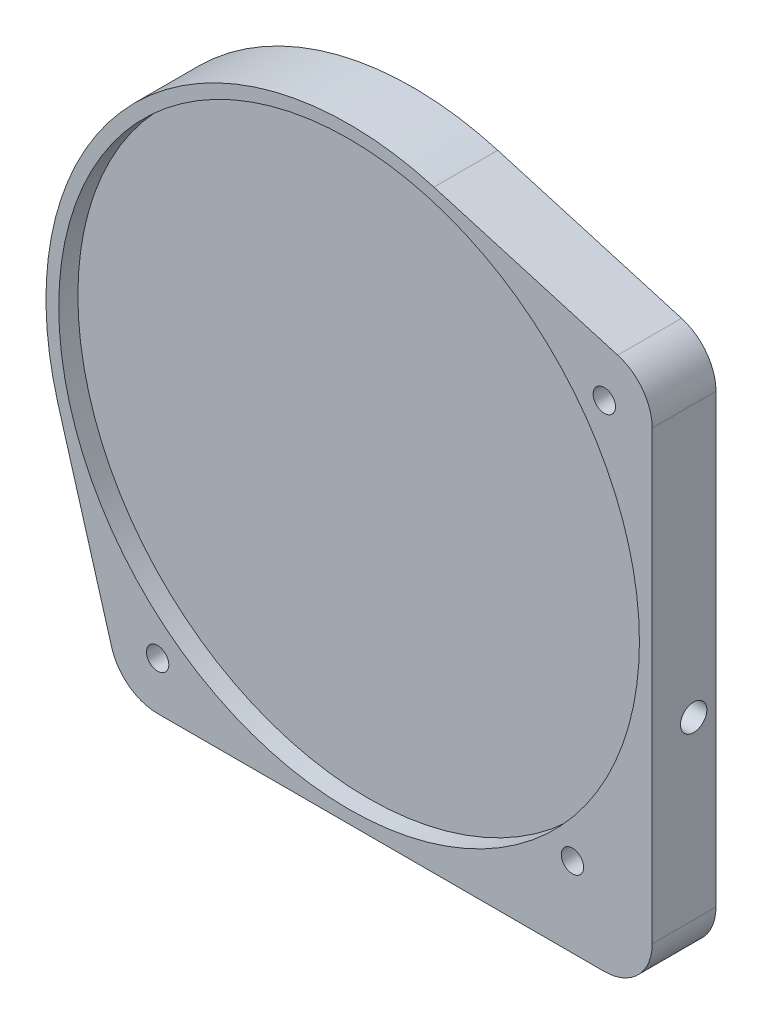
ISO-10303-21;
HEADER;
FILE_DESCRIPTION(('STEP AP214'),'2;1');
FILE_NAME('part.step','',(''),(''),'','','');
FILE_SCHEMA(('AUTOMOTIVE_DESIGN { 1 0 10303 214 1 1 1 1 }'));
ENDSEC;
DATA;
#1=APPLICATION_CONTEXT('core data for automotive mechanical design processes');
#2=APPLICATION_PROTOCOL_DEFINITION('international standard','automotive_design',2000,#1);
#3=PRODUCT_CONTEXT('',#1,'mechanical');
#4=PRODUCT('Part','Part','',(#3));
#5=PRODUCT_RELATED_PRODUCT_CATEGORY('part','',(#4));
#6=PRODUCT_DEFINITION_FORMATION('','',#4);
#7=PRODUCT_DEFINITION_CONTEXT('part definition',#1,'design');
#8=PRODUCT_DEFINITION('design','',#6,#7);
#9=PRODUCT_DEFINITION_SHAPE('','',#8);
#10=(LENGTH_UNIT() NAMED_UNIT(*) SI_UNIT(.MILLI.,.METRE.));
#11=(NAMED_UNIT(*) PLANE_ANGLE_UNIT() SI_UNIT($,.RADIAN.));
#12=(NAMED_UNIT(*) SI_UNIT($,.STERADIAN.) SOLID_ANGLE_UNIT());
#13=UNCERTAINTY_MEASURE_WITH_UNIT(LENGTH_MEASURE(1.E-05),#10,'distance_accuracy_value','');
#14=(GEOMETRIC_REPRESENTATION_CONTEXT(3) GLOBAL_UNCERTAINTY_ASSIGNED_CONTEXT((#13)) GLOBAL_UNIT_ASSIGNED_CONTEXT((#10,
#11,#12)) REPRESENTATION_CONTEXT('',''));
#15=CARTESIAN_POINT('',(0.,0.,0.));
#16=DIRECTION('',(0.,0.,1.));
#17=DIRECTION('',(1.,0.,0.));
#18=AXIS2_PLACEMENT_3D('',#15,#16,#17);
#19=CARTESIAN_POINT('',(0.,0.,7.));
#20=DIRECTION('',(0.,0.,-1.));
#21=DIRECTION('',(-1.,0.,0.));
#22=AXIS2_PLACEMENT_3D('',#19,#20,#21);
#23=PLANE('',#22);
#24=CARTESIAN_POINT('',(0.,0.,7.));
#25=DIRECTION('',(0.,0.,-1.));
#26=DIRECTION('',(-1.,0.,0.));
#27=AXIS2_PLACEMENT_3D('',#24,#25,#26);
#28=CIRCLE('',#27,45.5);
#29=CARTESIAN_POINT('',(-45.5,0.,7.));
#30=VERTEX_POINT('',#29);
#31=EDGE_CURVE('E20',#30,#30,#28,.F.);
#32=ORIENTED_EDGE('',*,*,#31,.T.);
#33=EDGE_LOOP('',(#32));
#34=FACE_BOUND('',#33,.T.);
#35=ADVANCED_FACE('F17',(#34),#23,.F.);
#36=CARTESIAN_POINT('',(12.5,-35.5000000012069,3.5));
#37=DIRECTION('',(0.,-1.,0.));
#38=DIRECTION('',(1.,0.,0.));
#39=AXIS2_PLACEMENT_3D('',#36,#37,#38);
#40=CONICAL_SURFACE('',#39,2.0669999992606,1.02974425746904);
#41=CARTESIAN_POINT('',(12.4999999999318,-34.2580210987649,3.5));
#42=VERTEX_POINT('',#41);
#43=VERTEX_LOOP('',#42);
#44=FACE_BOUND('',#43,.T.);
#45=CARTESIAN_POINT('',(12.5,-35.5,3.5));
#46=DIRECTION('',(0.,-1.,0.));
#47=DIRECTION('',(1.,0.,0.));
#48=AXIS2_PLACEMENT_3D('',#45,#46,#47);
#49=CIRCLE('',#48,2.067);
#50=CARTESIAN_POINT('',(14.567,-35.5,3.5));
#51=VERTEX_POINT('',#50);
#52=EDGE_CURVE('E95',#51,#51,#49,.T.);
#53=ORIENTED_EDGE('',*,*,#52,.T.);
#54=EDGE_LOOP('',(#53));
#55=FACE_BOUND('',#54,.T.);
#56=ADVANCED_FACE('F89',(#44,#55),#40,.F.);
#57=CARTESIAN_POINT('',(35.5000000012069,-12.5,3.5));
#58=DIRECTION('',(1.,0.,0.));
#59=DIRECTION('',(0.,0.,-1.));
#60=AXIS2_PLACEMENT_3D('',#57,#58,#59);
#61=CONICAL_SURFACE('',#60,2.06699999924103,1.02974425750216);
#62=CARTESIAN_POINT('',(34.2580210988785,-12.5,3.49999999991724));
#63=VERTEX_POINT('',#62);
#64=VERTEX_LOOP('',#63);
#65=FACE_BOUND('',#64,.T.);
#66=CARTESIAN_POINT('',(35.5,-12.5,3.5));
#67=DIRECTION('',(1.,0.,0.));
#68=DIRECTION('',(0.,1.,0.));
#69=AXIS2_PLACEMENT_3D('',#66,#67,#68);
#70=CIRCLE('',#69,2.067);
#71=CARTESIAN_POINT('',(35.5,-10.433,3.5));
#72=VERTEX_POINT('',#71);
#73=EDGE_CURVE('E97',#72,#72,#70,.T.);
#74=ORIENTED_EDGE('',*,*,#73,.T.);
#75=EDGE_LOOP('',(#74));
#76=FACE_BOUND('',#75,.T.);
#77=ADVANCED_FACE('F92',(#65,#76),#61,.F.);
#78=CARTESIAN_POINT('',(0.,0.,10.));
#79=DIRECTION('',(0.,0.,-1.));
#80=DIRECTION('',(-1.,0.,0.));
#81=AXIS2_PLACEMENT_3D('',#78,#79,#80);
#82=CYLINDRICAL_SURFACE('',#81,45.5);
#83=CARTESIAN_POINT('',(0.,0.,10.));
#84=DIRECTION('',(0.,0.,-1.));
#85=DIRECTION('',(-1.,0.,0.));
#86=AXIS2_PLACEMENT_3D('',#83,#84,#85);
#87=CIRCLE('',#86,45.5);
#88=CARTESIAN_POINT('',(-45.5,0.,10.));
#89=VERTEX_POINT('',#88);
#90=EDGE_CURVE('E100',#89,#89,#87,.T.);
#91=ORIENTED_EDGE('',*,*,#90,.F.);
#92=EDGE_LOOP('',(#91));
#93=FACE_BOUND('',#92,.T.);
#94=ORIENTED_EDGE('',*,*,#31,.F.);
#95=EDGE_LOOP('',(#94));
#96=FACE_BOUND('',#95,.T.);
#97=ADVANCED_FACE('F169',(#93,#96),#82,.F.);
#98=CARTESIAN_POINT('',(12.5,-41.5,3.5));
#99=DIRECTION('',(0.,-1.,0.));
#100=DIRECTION('',(1.,0.,0.));
#101=AXIS2_PLACEMENT_3D('',#98,#99,#100);
#102=CYLINDRICAL_SURFACE('',#101,2.067);
#103=ORIENTED_EDGE('',*,*,#52,.F.);
#104=EDGE_LOOP('',(#103));
#105=FACE_BOUND('',#104,.T.);
#106=CARTESIAN_POINT('',(12.5,-47.5,3.5));
#107=DIRECTION('',(0.,-1.,0.));
#108=DIRECTION('',(1.,0.,0.));
#109=AXIS2_PLACEMENT_3D('',#106,#107,#108);
#110=CIRCLE('',#109,2.067);
#111=CARTESIAN_POINT('',(14.567,-47.5,3.5));
#112=VERTEX_POINT('',#111);
#113=EDGE_CURVE('E153',#112,#112,#110,.F.);
#114=ORIENTED_EDGE('',*,*,#113,.F.);
#115=EDGE_LOOP('',(#114));
#116=FACE_BOUND('',#115,.T.);
#117=ADVANCED_FACE('F172',(#105,#116),#102,.F.);
#118=CARTESIAN_POINT('',(41.5,-12.5,3.5));
#119=DIRECTION('',(1.,0.,0.));
#120=DIRECTION('',(0.,1.,0.));
#121=AXIS2_PLACEMENT_3D('',#118,#119,#120);
#122=CYLINDRICAL_SURFACE('',#121,2.067);
#123=ORIENTED_EDGE('',*,*,#73,.F.);
#124=EDGE_LOOP('',(#123));
#125=FACE_BOUND('',#124,.T.);
#126=CARTESIAN_POINT('',(47.5,-12.5,3.5));
#127=DIRECTION('',(1.,0.,0.));
#128=DIRECTION('',(0.,1.,0.));
#129=AXIS2_PLACEMENT_3D('',#126,#127,#128);
#130=CIRCLE('',#129,2.067);
#131=CARTESIAN_POINT('',(47.5,-10.433,3.5));
#132=VERTEX_POINT('',#131);
#133=EDGE_CURVE('E146',#132,#132,#130,.F.);
#134=ORIENTED_EDGE('',*,*,#133,.F.);
#135=EDGE_LOOP('',(#134));
#136=FACE_BOUND('',#135,.T.);
#137=ADVANCED_FACE('F234',(#125,#136),#122,.F.);
#138=CARTESIAN_POINT('',(3.65924685578279,-3.6592468557828,10.));
#139=DIRECTION('',(0.,0.,1.));
#140=DIRECTION('',(1.,0.,0.));
#141=AXIS2_PLACEMENT_3D('',#138,#139,#140);
#142=PLANE('',#141);
#143=ORIENTED_EDGE('',*,*,#90,.T.);
#144=EDGE_LOOP('',(#143));
#145=FACE_BOUND('',#144,.T.);
#146=CARTESIAN_POINT('',(40.,30.,10.));
#147=DIRECTION('',(0.,0.,1.));
#148=DIRECTION('',(1.,0.,0.));
#149=AXIS2_PLACEMENT_3D('',#146,#147,#148);
#150=CIRCLE('',#149,1.75);
#151=CARTESIAN_POINT('',(41.75,30.,10.));
#152=VERTEX_POINT('',#151);
#153=EDGE_CURVE('E137',#152,#152,#150,.F.);
#154=ORIENTED_EDGE('',*,*,#153,.T.);
#155=EDGE_LOOP('',(#154));
#156=FACE_BOUND('',#155,.T.);
#157=CARTESIAN_POINT('',(-30.,-40.,10.));
#158=DIRECTION('',(0.,0.,1.));
#159=DIRECTION('',(1.,0.,0.));
#160=AXIS2_PLACEMENT_3D('',#157,#158,#159);
#161=CIRCLE('',#160,1.75);
#162=CARTESIAN_POINT('',(-28.25,-40.,10.));
#163=VERTEX_POINT('',#162);
#164=EDGE_CURVE('E140',#163,#163,#161,.F.);
#165=ORIENTED_EDGE('',*,*,#164,.T.);
#166=EDGE_LOOP('',(#165));
#167=FACE_BOUND('',#166,.T.);
#168=CARTESIAN_POINT('',(35.,-35.,10.));
#169=DIRECTION('',(0.,0.,1.));
#170=DIRECTION('',(1.,0.,0.));
#171=AXIS2_PLACEMENT_3D('',#168,#169,#170);
#172=CIRCLE('',#171,1.75);
#173=CARTESIAN_POINT('',(36.75,-35.,10.));
#174=VERTEX_POINT('',#173);
#175=EDGE_CURVE('E143',#174,#174,#172,.F.);
#176=ORIENTED_EDGE('',*,*,#175,.T.);
#177=EDGE_LOOP('',(#176));
#178=FACE_BOUND('',#177,.T.);
#179=CARTESIAN_POINT('',(-30.,-40.,10.));
#180=DIRECTION('',(0.,0.,1.));
#181=DIRECTION('',(1.,0.,0.));
#182=AXIS2_PLACEMENT_3D('',#179,#180,#181);
#183=CIRCLE('',#182,7.49999999999999);
#184=CARTESIAN_POINT('',(-30.,-47.5,10.));
#185=VERTEX_POINT('',#184);
#186=CARTESIAN_POINT('',(-37.2,-42.1,10.));
#187=VERTEX_POINT('',#186);
#188=EDGE_CURVE('E157',#185,#187,#183,.F.);
#189=ORIENTED_EDGE('',*,*,#188,.F.);
#190=DIRECTION('',(1.,0.,0.));
#191=VECTOR('',#190,1.);
#192=CARTESIAN_POINT('',(40.,-47.5,10.));
#193=LINE('',#192,#191);
#194=CARTESIAN_POINT('',(40.,-47.5,10.));
#195=VERTEX_POINT('',#194);
#196=EDGE_CURVE('E105',#195,#185,#193,.F.);
#197=ORIENTED_EDGE('',*,*,#196,.F.);
#198=CARTESIAN_POINT('',(40.,-40.,10.));
#199=DIRECTION('',(0.,0.,1.));
#200=DIRECTION('',(1.,0.,0.));
#201=AXIS2_PLACEMENT_3D('',#198,#199,#200);
#202=CIRCLE('',#201,7.49999999999998);
#203=CARTESIAN_POINT('',(47.4999999999999,-40.,10.));
#204=VERTEX_POINT('',#203);
#205=EDGE_CURVE('E150',#204,#195,#202,.F.);
#206=ORIENTED_EDGE('',*,*,#205,.F.);
#207=DIRECTION('',(0.,1.,0.));
#208=VECTOR('',#207,1.);
#209=CARTESIAN_POINT('',(47.4999999999999,30.,10.));
#210=LINE('',#209,#208);
#211=CARTESIAN_POINT('',(47.4999999999999,30.,10.));
#212=VERTEX_POINT('',#211);
#213=EDGE_CURVE('E261',#212,#204,#210,.F.);
#214=ORIENTED_EDGE('',*,*,#213,.F.);
#215=CARTESIAN_POINT('',(40.,30.,10.));
#216=DIRECTION('',(0.,0.,1.));
#217=DIRECTION('',(1.,0.,0.));
#218=AXIS2_PLACEMENT_3D('',#215,#216,#217);
#219=CIRCLE('',#218,7.50000000000001);
#220=CARTESIAN_POINT('',(42.1,37.2,10.));
#221=VERTEX_POINT('',#220);
#222=EDGE_CURVE('E114',#221,#212,#219,.F.);
#223=ORIENTED_EDGE('',*,*,#222,.F.);
#224=DIRECTION('',(-0.96,0.28,0.));
#225=VECTOR('',#224,1.);
#226=CARTESIAN_POINT('',(13.3,45.6,10.));
#227=LINE('',#226,#225);
#228=CARTESIAN_POINT('',(13.3,45.6,10.));
#229=VERTEX_POINT('',#228);
#230=EDGE_CURVE('E81',#229,#221,#227,.F.);
#231=ORIENTED_EDGE('',*,*,#230,.F.);
#232=CARTESIAN_POINT('',(0.,0.,10.));
#233=DIRECTION('',(0.,0.,1.));
#234=DIRECTION('',(1.,0.,0.));
#235=AXIS2_PLACEMENT_3D('',#232,#233,#234);
#236=CIRCLE('',#235,47.5);
#237=CARTESIAN_POINT('',(-45.6,-13.3,10.));
#238=VERTEX_POINT('',#237);
#239=EDGE_CURVE('E160',#238,#229,#236,.F.);
#240=ORIENTED_EDGE('',*,*,#239,.F.);
#241=DIRECTION('',(0.28,-0.96,0.));
#242=VECTOR('',#241,1.);
#243=CARTESIAN_POINT('',(-37.2,-42.1,10.));
#244=LINE('',#243,#242);
#245=EDGE_CURVE('E109',#187,#238,#244,.F.);
#246=ORIENTED_EDGE('',*,*,#245,.F.);
#247=EDGE_LOOP('',(#189,#197,#206,#214,#223,#231,#240,#246));
#248=FACE_BOUND('',#247,.T.);
#249=ADVANCED_FACE('F166',(#145,#156,#167,#178,#248),#142,.T.);
#250=CARTESIAN_POINT('',(40.,30.,0.));
#251=DIRECTION('',(0.,0.,1.));
#252=DIRECTION('',(1.,0.,0.));
#253=AXIS2_PLACEMENT_3D('',#250,#251,#252);
#254=CYLINDRICAL_SURFACE('',#253,7.50000000000001);
#255=CARTESIAN_POINT('',(40.,30.,0.));
#256=DIRECTION('',(0.,0.,1.));
#257=DIRECTION('',(1.,0.,0.));
#258=AXIS2_PLACEMENT_3D('',#255,#256,#257);
#259=CIRCLE('',#258,7.50000000000001);
#260=CARTESIAN_POINT('',(47.5,30.,0.));
#261=VERTEX_POINT('',#260);
#262=CARTESIAN_POINT('',(42.1,37.2,0.));
#263=VERTEX_POINT('',#262);
#264=EDGE_CURVE('E134',#261,#263,#259,.T.);
#265=ORIENTED_EDGE('',*,*,#264,.T.);
#266=DIRECTION('',(0.,0.,1.));
#267=VECTOR('',#266,1.);
#268=CARTESIAN_POINT('',(42.1,37.2,0.));
#269=LINE('',#268,#267);
#270=EDGE_CURVE('E113',#221,#263,#269,.F.);
#271=ORIENTED_EDGE('',*,*,#270,.F.);
#272=ORIENTED_EDGE('',*,*,#222,.T.);
#273=DIRECTION('',(0.,0.,-1.));
#274=VECTOR('',#273,1.);
#275=CARTESIAN_POINT('',(47.4999999999999,30.,0.));
#276=LINE('',#275,#274);
#277=EDGE_CURVE('E149',#261,#212,#276,.F.);
#278=ORIENTED_EDGE('',*,*,#277,.F.);
#279=EDGE_LOOP('',(#265,#271,#272,#278));
#280=FACE_BOUND('',#279,.T.);
#281=ADVANCED_FACE('F228',(#280),#254,.T.);
#282=CARTESIAN_POINT('',(13.3,45.6,0.));
#283=DIRECTION('',(0.28,0.96,0.));
#284=DIRECTION('',(-0.96,0.28,0.));
#285=AXIS2_PLACEMENT_3D('',#282,#283,#284);
#286=PLANE('',#285);
#287=DIRECTION('',(-0.96,0.28,0.));
#288=VECTOR('',#287,1.);
#289=CARTESIAN_POINT('',(42.1,37.2,0.));
#290=LINE('',#289,#288);
#291=CARTESIAN_POINT('',(13.3,45.6,0.));
#292=VERTEX_POINT('',#291);
#293=EDGE_CURVE('E133',#263,#292,#290,.T.);
#294=ORIENTED_EDGE('',*,*,#293,.T.);
#295=DIRECTION('',(0.,0.,1.));
#296=VECTOR('',#295,1.);
#297=CARTESIAN_POINT('',(13.3,45.6,0.));
#298=LINE('',#297,#296);
#299=EDGE_CURVE('E112',#229,#292,#298,.F.);
#300=ORIENTED_EDGE('',*,*,#299,.F.);
#301=ORIENTED_EDGE('',*,*,#230,.T.);
#302=ORIENTED_EDGE('',*,*,#270,.T.);
#303=EDGE_LOOP('',(#294,#300,#301,#302));
#304=FACE_BOUND('',#303,.T.);
#305=ADVANCED_FACE('F224',(#304),#286,.T.);
#306=CARTESIAN_POINT('',(0.,0.,0.));
#307=DIRECTION('',(0.,0.,1.));
#308=DIRECTION('',(1.,0.,0.));
#309=AXIS2_PLACEMENT_3D('',#306,#307,#308);
#310=CYLINDRICAL_SURFACE('',#309,47.5);
#311=CARTESIAN_POINT('',(0.,0.,0.));
#312=DIRECTION('',(0.,0.,1.));
#313=DIRECTION('',(1.,0.,0.));
#314=AXIS2_PLACEMENT_3D('',#311,#312,#313);
#315=CIRCLE('',#314,47.5);
#316=CARTESIAN_POINT('',(-45.6,-13.3,0.));
#317=VERTEX_POINT('',#316);
#318=EDGE_CURVE('E130',#292,#317,#315,.T.);
#319=ORIENTED_EDGE('',*,*,#318,.T.);
#320=DIRECTION('',(0.,0.,1.));
#321=VECTOR('',#320,1.);
#322=CARTESIAN_POINT('',(-45.6,-13.3,0.));
#323=LINE('',#322,#321);
#324=EDGE_CURVE('E111',#238,#317,#323,.F.);
#325=ORIENTED_EDGE('',*,*,#324,.F.);
#326=ORIENTED_EDGE('',*,*,#239,.T.);
#327=ORIENTED_EDGE('',*,*,#299,.T.);
#328=EDGE_LOOP('',(#319,#325,#326,#327));
#329=FACE_BOUND('',#328,.T.);
#330=ADVANCED_FACE('F220',(#329),#310,.T.);
#331=CARTESIAN_POINT('',(-37.2,-42.1,0.));
#332=DIRECTION('',(-0.96,-0.28,0.));
#333=DIRECTION('',(0.28,-0.96,0.));
#334=AXIS2_PLACEMENT_3D('',#331,#332,#333);
#335=PLANE('',#334);
#336=DIRECTION('',(0.28,-0.96,0.));
#337=VECTOR('',#336,1.);
#338=CARTESIAN_POINT('',(-45.6,-13.3,0.));
#339=LINE('',#338,#337);
#340=CARTESIAN_POINT('',(-37.2,-42.1,0.));
#341=VERTEX_POINT('',#340);
#342=EDGE_CURVE('E129',#317,#341,#339,.T.);
#343=ORIENTED_EDGE('',*,*,#342,.T.);
#344=DIRECTION('',(0.,0.,1.));
#345=VECTOR('',#344,1.);
#346=CARTESIAN_POINT('',(-37.2,-42.1,0.));
#347=LINE('',#346,#345);
#348=EDGE_CURVE('E159',#187,#341,#347,.F.);
#349=ORIENTED_EDGE('',*,*,#348,.F.);
#350=ORIENTED_EDGE('',*,*,#245,.T.);
#351=ORIENTED_EDGE('',*,*,#324,.T.);
#352=EDGE_LOOP('',(#343,#349,#350,#351));
#353=FACE_BOUND('',#352,.T.);
#354=ADVANCED_FACE('F216',(#353),#335,.T.);
#355=CARTESIAN_POINT('',(-30.,-40.,0.));
#356=DIRECTION('',(0.,0.,1.));
#357=DIRECTION('',(1.,0.,0.));
#358=AXIS2_PLACEMENT_3D('',#355,#356,#357);
#359=CYLINDRICAL_SURFACE('',#358,7.49999999999999);
#360=CARTESIAN_POINT('',(-30.,-40.,0.));
#361=DIRECTION('',(0.,0.,1.));
#362=DIRECTION('',(1.,0.,0.));
#363=AXIS2_PLACEMENT_3D('',#360,#361,#362);
#364=CIRCLE('',#363,7.49999999999999);
#365=CARTESIAN_POINT('',(-30.,-47.5,0.));
#366=VERTEX_POINT('',#365);
#367=EDGE_CURVE('E126',#341,#366,#364,.T.);
#368=ORIENTED_EDGE('',*,*,#367,.T.);
#369=DIRECTION('',(0.,0.,-1.));
#370=VECTOR('',#369,1.);
#371=CARTESIAN_POINT('',(-30.,-47.5,0.));
#372=LINE('',#371,#370);
#373=EDGE_CURVE('E156',#185,#366,#372,.T.);
#374=ORIENTED_EDGE('',*,*,#373,.F.);
#375=ORIENTED_EDGE('',*,*,#188,.T.);
#376=ORIENTED_EDGE('',*,*,#348,.T.);
#377=EDGE_LOOP('',(#368,#374,#375,#376));
#378=FACE_BOUND('',#377,.T.);
#379=ADVANCED_FACE('F212',(#378),#359,.T.);
#380=CARTESIAN_POINT('',(40.,-47.5,0.));
#381=DIRECTION('',(0.,-1.,0.));
#382=DIRECTION('',(0.,0.,-1.));
#383=AXIS2_PLACEMENT_3D('',#380,#381,#382);
#384=PLANE('',#383);
#385=ORIENTED_EDGE('',*,*,#113,.T.);
#386=EDGE_LOOP('',(#385));
#387=FACE_BOUND('',#386,.T.);
#388=DIRECTION('',(1.,0.,0.));
#389=VECTOR('',#388,1.);
#390=CARTESIAN_POINT('',(3.65924685578279,-47.5000000000001,0.));
#391=LINE('',#390,#389);
#392=CARTESIAN_POINT('',(40.,-47.5,0.));
#393=VERTEX_POINT('',#392);
#394=EDGE_CURVE('E125',#366,#393,#391,.T.);
#395=ORIENTED_EDGE('',*,*,#394,.T.);
#396=DIRECTION('',(0.,0.,1.));
#397=VECTOR('',#396,1.);
#398=CARTESIAN_POINT('',(40.,-47.5,0.));
#399=LINE('',#398,#397);
#400=EDGE_CURVE('E152',#195,#393,#399,.F.);
#401=ORIENTED_EDGE('',*,*,#400,.F.);
#402=ORIENTED_EDGE('',*,*,#196,.T.);
#403=ORIENTED_EDGE('',*,*,#373,.T.);
#404=EDGE_LOOP('',(#395,#401,#402,#403));
#405=FACE_BOUND('',#404,.T.);
#406=ADVANCED_FACE('F208',(#387,#405),#384,.T.);
#407=CARTESIAN_POINT('',(40.,-40.,0.));
#408=DIRECTION('',(0.,0.,1.));
#409=DIRECTION('',(1.,0.,0.));
#410=AXIS2_PLACEMENT_3D('',#407,#408,#409);
#411=CYLINDRICAL_SURFACE('',#410,7.49999999999998);
#412=CARTESIAN_POINT('',(40.,-40.,0.));
#413=DIRECTION('',(0.,0.,1.));
#414=DIRECTION('',(1.,0.,0.));
#415=AXIS2_PLACEMENT_3D('',#412,#413,#414);
#416=CIRCLE('',#415,7.49999999999998);
#417=CARTESIAN_POINT('',(47.5,-40.,0.));
#418=VERTEX_POINT('',#417);
#419=EDGE_CURVE('E122',#393,#418,#416,.T.);
#420=ORIENTED_EDGE('',*,*,#419,.T.);
#421=DIRECTION('',(0.,0.,-1.));
#422=VECTOR('',#421,1.);
#423=CARTESIAN_POINT('',(47.4999999999999,-40.,0.));
#424=LINE('',#423,#422);
#425=EDGE_CURVE('E35',#204,#418,#424,.T.);
#426=ORIENTED_EDGE('',*,*,#425,.F.);
#427=ORIENTED_EDGE('',*,*,#205,.T.);
#428=ORIENTED_EDGE('',*,*,#400,.T.);
#429=EDGE_LOOP('',(#420,#426,#427,#428));
#430=FACE_BOUND('',#429,.T.);
#431=ADVANCED_FACE('F204',(#430),#411,.T.);
#432=CARTESIAN_POINT('',(47.4999999999999,30.,0.));
#433=DIRECTION('',(1.,0.,0.));
#434=DIRECTION('',(0.,0.,-1.));
#435=AXIS2_PLACEMENT_3D('',#432,#433,#434);
#436=PLANE('',#435);
#437=ORIENTED_EDGE('',*,*,#133,.T.);
#438=EDGE_LOOP('',(#437));
#439=FACE_BOUND('',#438,.T.);
#440=DIRECTION('',(0.,1.,0.));
#441=VECTOR('',#440,1.);
#442=CARTESIAN_POINT('',(47.5,-3.6592468557828,0.));
#443=LINE('',#442,#441);
#444=EDGE_CURVE('E121',#418,#261,#443,.T.);
#445=ORIENTED_EDGE('',*,*,#444,.T.);
#446=ORIENTED_EDGE('',*,*,#277,.T.);
#447=ORIENTED_EDGE('',*,*,#213,.T.);
#448=ORIENTED_EDGE('',*,*,#425,.T.);
#449=EDGE_LOOP('',(#445,#446,#447,#448));
#450=FACE_BOUND('',#449,.T.);
#451=ADVANCED_FACE('F200',(#439,#450),#436,.T.);
#452=CARTESIAN_POINT('',(35.,-35.,-124.721935853075));
#453=DIRECTION('',(0.,0.,1.));
#454=DIRECTION('',(1.,0.,0.));
#455=AXIS2_PLACEMENT_3D('',#452,#453,#454);
#456=CYLINDRICAL_SURFACE('',#455,1.75);
#457=ORIENTED_EDGE('',*,*,#175,.F.);
#458=EDGE_LOOP('',(#457));
#459=FACE_BOUND('',#458,.T.);
#460=CARTESIAN_POINT('',(35.,-35.,0.));
#461=DIRECTION('',(0.,0.,1.));
#462=DIRECTION('',(1.,0.,0.));
#463=AXIS2_PLACEMENT_3D('',#460,#461,#462);
#464=CIRCLE('',#463,1.75);
#465=CARTESIAN_POINT('',(36.75,-35.,0.));
#466=VERTEX_POINT('',#465);
#467=EDGE_CURVE('E118',#466,#466,#464,.F.);
#468=ORIENTED_EDGE('',*,*,#467,.T.);
#469=EDGE_LOOP('',(#468));
#470=FACE_BOUND('',#469,.T.);
#471=ADVANCED_FACE('F196',(#459,#470),#456,.F.);
#472=CARTESIAN_POINT('',(-30.,-40.,-124.721935853075));
#473=DIRECTION('',(0.,0.,1.));
#474=DIRECTION('',(1.,0.,0.));
#475=AXIS2_PLACEMENT_3D('',#472,#473,#474);
#476=CYLINDRICAL_SURFACE('',#475,1.75);
#477=ORIENTED_EDGE('',*,*,#164,.F.);
#478=EDGE_LOOP('',(#477));
#479=FACE_BOUND('',#478,.T.);
#480=CARTESIAN_POINT('',(-30.,-40.,0.));
#481=DIRECTION('',(0.,0.,1.));
#482=DIRECTION('',(1.,0.,0.));
#483=AXIS2_PLACEMENT_3D('',#480,#481,#482);
#484=CIRCLE('',#483,1.75);
#485=CARTESIAN_POINT('',(-28.25,-40.,0.));
#486=VERTEX_POINT('',#485);
#487=EDGE_CURVE('E26',#486,#486,#484,.F.);
#488=ORIENTED_EDGE('',*,*,#487,.T.);
#489=EDGE_LOOP('',(#488));
#490=FACE_BOUND('',#489,.T.);
#491=ADVANCED_FACE('F188',(#479,#490),#476,.F.);
#492=CARTESIAN_POINT('',(40.,30.,-124.721935853075));
#493=DIRECTION('',(0.,0.,1.));
#494=DIRECTION('',(1.,0.,0.));
#495=AXIS2_PLACEMENT_3D('',#492,#493,#494);
#496=CYLINDRICAL_SURFACE('',#495,1.75);
#497=ORIENTED_EDGE('',*,*,#153,.F.);
#498=EDGE_LOOP('',(#497));
#499=FACE_BOUND('',#498,.T.);
#500=CARTESIAN_POINT('',(40.,30.,0.));
#501=DIRECTION('',(0.,0.,1.));
#502=DIRECTION('',(1.,0.,0.));
#503=AXIS2_PLACEMENT_3D('',#500,#501,#502);
#504=CIRCLE('',#503,1.75);
#505=CARTESIAN_POINT('',(41.75,30.,0.));
#506=VERTEX_POINT('',#505);
#507=EDGE_CURVE('E11',#506,#506,#504,.F.);
#508=ORIENTED_EDGE('',*,*,#507,.T.);
#509=EDGE_LOOP('',(#508));
#510=FACE_BOUND('',#509,.T.);
#511=ADVANCED_FACE('F182',(#499,#510),#496,.F.);
#512=CARTESIAN_POINT('',(3.65924685578279,-3.6592468557828,0.));
#513=DIRECTION('',(0.,0.,1.));
#514=DIRECTION('',(1.,0.,0.));
#515=AXIS2_PLACEMENT_3D('',#512,#513,#514);
#516=PLANE('',#515);
#517=ORIENTED_EDGE('',*,*,#507,.F.);
#518=EDGE_LOOP('',(#517));
#519=FACE_BOUND('',#518,.T.);
#520=ORIENTED_EDGE('',*,*,#487,.F.);
#521=EDGE_LOOP('',(#520));
#522=FACE_BOUND('',#521,.T.);
#523=ORIENTED_EDGE('',*,*,#467,.F.);
#524=EDGE_LOOP('',(#523));
#525=FACE_BOUND('',#524,.T.);
#526=ORIENTED_EDGE('',*,*,#419,.F.);
#527=ORIENTED_EDGE('',*,*,#394,.F.);
#528=ORIENTED_EDGE('',*,*,#367,.F.);
#529=ORIENTED_EDGE('',*,*,#342,.F.);
#530=ORIENTED_EDGE('',*,*,#318,.F.);
#531=ORIENTED_EDGE('',*,*,#293,.F.);
#532=ORIENTED_EDGE('',*,*,#264,.F.);
#533=ORIENTED_EDGE('',*,*,#444,.F.);
#534=EDGE_LOOP('',(#526,#527,#528,#529,#530,#531,#532,#533));
#535=FACE_BOUND('',#534,.T.);
#536=ADVANCED_FACE('F180',(#519,#522,#525,#535),#516,.F.);
#537=CLOSED_SHELL('',(#35,#56,#77,#97,#117,#137,#249,#281,#305,#330,#354,#379,#406,#431,#451,
#471,#491,#511,#536));
#538=MANIFOLD_SOLID_BREP('B1',#537);
#539=ADVANCED_BREP_SHAPE_REPRESENTATION('',(#18,#538),#14);
#540=SHAPE_DEFINITION_REPRESENTATION(#9,#539);
ENDSEC;
END-ISO-10303-21;
